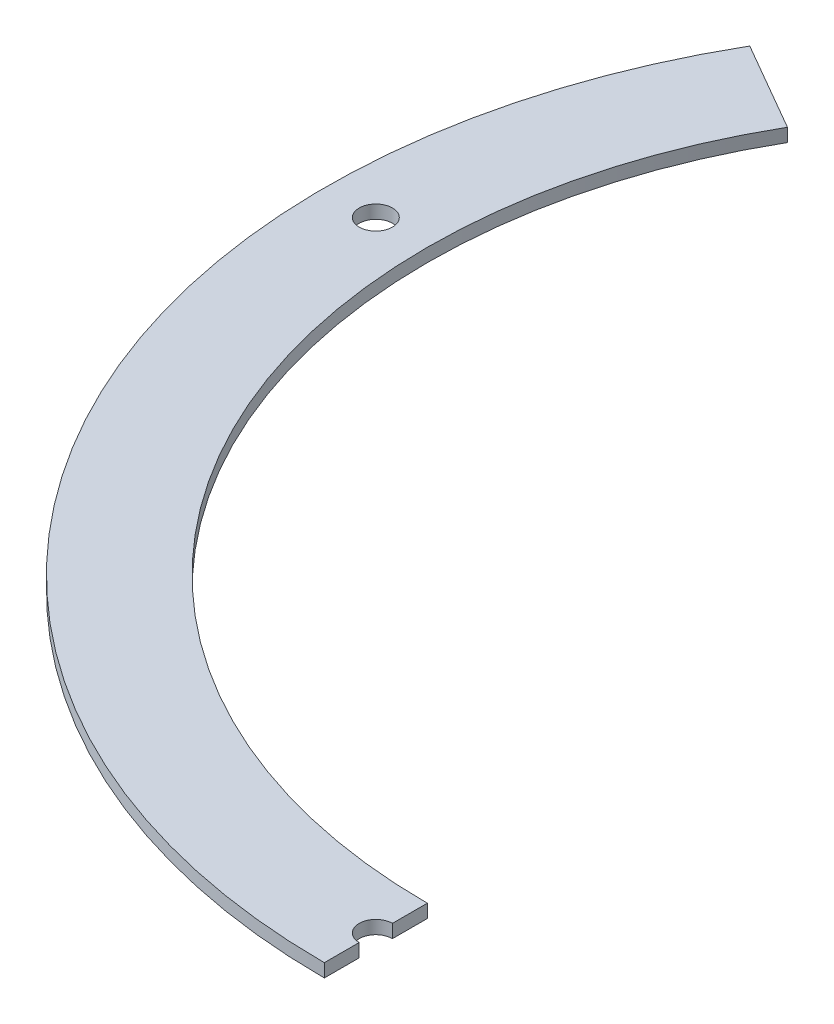
ISO-10303-21;
HEADER;
FILE_DESCRIPTION(('STEP AP214'),'2;1');
FILE_NAME('part.step','',(''),(''),'','','');
FILE_SCHEMA(('AUTOMOTIVE_DESIGN { 1 0 10303 214 1 1 1 1 }'));
ENDSEC;
DATA;
#1=APPLICATION_CONTEXT('core data for automotive mechanical design processes');
#2=APPLICATION_PROTOCOL_DEFINITION('international standard','automotive_design',2000,#1);
#3=PRODUCT_CONTEXT('',#1,'mechanical');
#4=PRODUCT('Part','Part','',(#3));
#5=PRODUCT_RELATED_PRODUCT_CATEGORY('part','',(#4));
#6=PRODUCT_DEFINITION_FORMATION('','',#4);
#7=PRODUCT_DEFINITION_CONTEXT('part definition',#1,'design');
#8=PRODUCT_DEFINITION('design','',#6,#7);
#9=PRODUCT_DEFINITION_SHAPE('','',#8);
#10=(LENGTH_UNIT() NAMED_UNIT(*) SI_UNIT(.MILLI.,.METRE.));
#11=(NAMED_UNIT(*) PLANE_ANGLE_UNIT() SI_UNIT($,.RADIAN.));
#12=(NAMED_UNIT(*) SI_UNIT($,.STERADIAN.) SOLID_ANGLE_UNIT());
#13=UNCERTAINTY_MEASURE_WITH_UNIT(LENGTH_MEASURE(1.E-05),#10,'distance_accuracy_value','');
#14=(GEOMETRIC_REPRESENTATION_CONTEXT(3) GLOBAL_UNCERTAINTY_ASSIGNED_CONTEXT((#13)) GLOBAL_UNIT_ASSIGNED_CONTEXT((#10,
#11,#12)) REPRESENTATION_CONTEXT('',''));
#15=CARTESIAN_POINT('',(0.,0.,0.));
#16=DIRECTION('',(0.,0.,1.));
#17=DIRECTION('',(1.,0.,0.));
#18=AXIS2_PLACEMENT_3D('',#15,#16,#17);
#19=CARTESIAN_POINT('',(0.,2.,0.));
#20=DIRECTION('',(0.,-1.,0.));
#21=DIRECTION('',(0.,0.,-1.));
#22=AXIS2_PLACEMENT_3D('',#19,#20,#21);
#23=CYLINDRICAL_SURFACE('',#22,101.);
#24=DIRECTION('',(0.,-1.,0.));
#25=VECTOR('',#24,1.);
#26=CARTESIAN_POINT('',(0.,2.,101.));
#27=LINE('',#26,#25);
#28=CARTESIAN_POINT('',(0.,2.,101.));
#29=VERTEX_POINT('',#28);
#30=CARTESIAN_POINT('',(0.,0.,101.));
#31=VERTEX_POINT('',#30);
#32=EDGE_CURVE('E106',#29,#31,#27,.T.);
#33=ORIENTED_EDGE('',*,*,#32,.F.);
#34=CARTESIAN_POINT('',(0.,2.,0.));
#35=DIRECTION('',(0.,1.,0.));
#36=DIRECTION('',(0.,0.,1.));
#37=AXIS2_PLACEMENT_3D('',#34,#35,#36);
#38=CIRCLE('',#37,101.);
#39=CARTESIAN_POINT('',(-87.4685657822286,2.,-50.4999999999995));
#40=VERTEX_POINT('',#39);
#41=EDGE_CURVE('E136',#40,#29,#38,.T.);
#42=ORIENTED_EDGE('',*,*,#41,.F.);
#43=DIRECTION('',(0.,-1.,0.));
#44=VECTOR('',#43,1.);
#45=CARTESIAN_POINT('',(-87.4685657822286,2.,-50.4999999999995));
#46=LINE('',#45,#44);
#47=CARTESIAN_POINT('',(-87.4685657822286,0.,-50.4999999999995));
#48=VERTEX_POINT('',#47);
#49=EDGE_CURVE('E124',#40,#48,#46,.T.);
#50=ORIENTED_EDGE('',*,*,#49,.T.);
#51=CARTESIAN_POINT('',(0.,0.,0.));
#52=DIRECTION('',(0.,1.,0.));
#53=DIRECTION('',(0.,0.,1.));
#54=AXIS2_PLACEMENT_3D('',#51,#52,#53);
#55=CIRCLE('',#54,101.);
#56=EDGE_CURVE('E130',#48,#31,#55,.T.);
#57=ORIENTED_EDGE('',*,*,#56,.T.);
#58=EDGE_LOOP('',(#33,#42,#50,#57));
#59=FACE_BOUND('',#58,.T.);
#60=ADVANCED_FACE('F45',(#59),#23,.T.);
#61=CARTESIAN_POINT('',(0.,2.,0.));
#62=DIRECTION('',(0.,-1.,0.));
#63=DIRECTION('',(0.,0.,-1.));
#64=AXIS2_PLACEMENT_3D('',#61,#62,#63);
#65=CYLINDRICAL_SURFACE('',#64,85.5);
#66=CARTESIAN_POINT('',(0.,2.,0.));
#67=DIRECTION('',(0.,1.,0.));
#68=DIRECTION('',(0.,0.,1.));
#69=AXIS2_PLACEMENT_3D('',#66,#67,#68);
#70=CIRCLE('',#69,85.5);
#71=CARTESIAN_POINT('',(-74.0451720235698,2.,-42.7499999999996));
#72=VERTEX_POINT('',#71);
#73=CARTESIAN_POINT('',(0.,2.,85.5));
#74=VERTEX_POINT('',#73);
#75=EDGE_CURVE('E11',#72,#74,#70,.T.);
#76=ORIENTED_EDGE('',*,*,#75,.T.);
#77=DIRECTION('',(0.,-1.,0.));
#78=VECTOR('',#77,1.);
#79=CARTESIAN_POINT('',(0.,2.,85.5));
#80=LINE('',#79,#78);
#81=CARTESIAN_POINT('',(0.,0.,85.5));
#82=VERTEX_POINT('',#81);
#83=EDGE_CURVE('E98',#74,#82,#80,.T.);
#84=ORIENTED_EDGE('',*,*,#83,.T.);
#85=CARTESIAN_POINT('',(0.,0.,0.));
#86=DIRECTION('',(0.,1.,0.));
#87=DIRECTION('',(0.,0.,1.));
#88=AXIS2_PLACEMENT_3D('',#85,#86,#87);
#89=CIRCLE('',#88,85.5);
#90=CARTESIAN_POINT('',(-74.0451720235698,0.,-42.7499999999996));
#91=VERTEX_POINT('',#90);
#92=EDGE_CURVE('E48',#91,#82,#89,.T.);
#93=ORIENTED_EDGE('',*,*,#92,.F.);
#94=DIRECTION('',(0.,-1.,0.));
#95=VECTOR('',#94,1.);
#96=CARTESIAN_POINT('',(-74.0451720235698,2.,-42.7499999999996));
#97=LINE('',#96,#95);
#98=EDGE_CURVE('E120',#72,#91,#97,.T.);
#99=ORIENTED_EDGE('',*,*,#98,.F.);
#100=EDGE_LOOP('',(#76,#84,#93,#99));
#101=FACE_BOUND('',#100,.T.);
#102=ADVANCED_FACE('F119',(#101),#65,.F.);
#103=CARTESIAN_POINT('',(0.,2.,0.));
#104=DIRECTION('',(0.,1.,0.));
#105=DIRECTION('',(0.,0.,1.));
#106=AXIS2_PLACEMENT_3D('',#103,#104,#105);
#107=PLANE('',#106);
#108=CARTESIAN_POINT('',(-93.25,2.,-9.76741904541367E-13));
#109=DIRECTION('',(0.,1.,0.));
#110=DIRECTION('',(0.,0.,1.));
#111=AXIS2_PLACEMENT_3D('',#108,#109,#110);
#112=CIRCLE('',#111,2.5);
#113=CARTESIAN_POINT('',(-93.25,2.,2.49999999999902));
#114=VERTEX_POINT('',#113);
#115=EDGE_CURVE('E140',#114,#114,#112,.T.);
#116=ORIENTED_EDGE('',*,*,#115,.F.);
#117=EDGE_LOOP('',(#116));
#118=FACE_BOUND('',#117,.T.);
#119=CARTESIAN_POINT('',(-6.51161269694244E-13,2.,93.25));
#120=DIRECTION('',(0.,1.,0.));
#121=DIRECTION('',(0.,0.,1.));
#122=AXIS2_PLACEMENT_3D('',#119,#120,#121);
#123=CIRCLE('',#122,2.5);
#124=CARTESIAN_POINT('',(-6.51161269694244E-13,2.,90.75));
#125=VERTEX_POINT('',#124);
#126=CARTESIAN_POINT('',(0.,2.,95.75));
#127=VERTEX_POINT('',#126);
#128=EDGE_CURVE('E54',#125,#127,#123,.T.);
#129=ORIENTED_EDGE('',*,*,#128,.F.);
#130=DIRECTION('',(0.,0.,1.));
#131=VECTOR('',#130,1.);
#132=CARTESIAN_POINT('',(0.,2.,0.));
#133=LINE('',#132,#131);
#134=EDGE_CURVE('E70',#74,#125,#133,.T.);
#135=ORIENTED_EDGE('',*,*,#134,.F.);
#136=ORIENTED_EDGE('',*,*,#75,.F.);
#137=DIRECTION('',(-0.866025403784442,0.,-0.499999999999995));
#138=VECTOR('',#137,1.);
#139=CARTESIAN_POINT('',(0.,2.,0.));
#140=LINE('',#139,#138);
#141=EDGE_CURVE('E125',#72,#40,#140,.T.);
#142=ORIENTED_EDGE('',*,*,#141,.T.);
#143=ORIENTED_EDGE('',*,*,#41,.T.);
#144=EDGE_CURVE('E107',#127,#29,#133,.T.);
#145=ORIENTED_EDGE('',*,*,#144,.F.);
#146=EDGE_LOOP('',(#129,#135,#136,#142,#143,#145));
#147=FACE_BOUND('',#146,.T.);
#148=ADVANCED_FACE('F112',(#118,#147),#107,.T.);
#149=CARTESIAN_POINT('',(0.,0.,0.));
#150=DIRECTION('',(0.,1.,0.));
#151=DIRECTION('',(0.,0.,1.));
#152=AXIS2_PLACEMENT_3D('',#149,#150,#151);
#153=PLANE('',#152);
#154=CARTESIAN_POINT('',(-93.25,0.,-9.76741904541367E-13));
#155=DIRECTION('',(0.,1.,0.));
#156=DIRECTION('',(0.,0.,1.));
#157=AXIS2_PLACEMENT_3D('',#154,#155,#156);
#158=CIRCLE('',#157,2.5);
#159=CARTESIAN_POINT('',(-93.25,0.,2.49999999999902));
#160=VERTEX_POINT('',#159);
#161=EDGE_CURVE('E149',#160,#160,#158,.T.);
#162=ORIENTED_EDGE('',*,*,#161,.T.);
#163=EDGE_LOOP('',(#162));
#164=FACE_BOUND('',#163,.T.);
#165=DIRECTION('',(0.,0.,1.));
#166=VECTOR('',#165,1.);
#167=CARTESIAN_POINT('',(0.,0.,0.));
#168=LINE('',#167,#166);
#169=CARTESIAN_POINT('',(0.,0.,90.75));
#170=VERTEX_POINT('',#169);
#171=EDGE_CURVE('E101',#82,#170,#168,.T.);
#172=ORIENTED_EDGE('',*,*,#171,.T.);
#173=CARTESIAN_POINT('',(-6.51161269694244E-13,0.,93.25));
#174=DIRECTION('',(0.,1.,0.));
#175=DIRECTION('',(0.,0.,1.));
#176=AXIS2_PLACEMENT_3D('',#173,#174,#175);
#177=CIRCLE('',#176,2.5);
#178=CARTESIAN_POINT('',(0.,0.,95.75));
#179=VERTEX_POINT('',#178);
#180=EDGE_CURVE('E152',#170,#179,#177,.T.);
#181=ORIENTED_EDGE('',*,*,#180,.T.);
#182=EDGE_CURVE('E62',#179,#31,#168,.T.);
#183=ORIENTED_EDGE('',*,*,#182,.T.);
#184=ORIENTED_EDGE('',*,*,#56,.F.);
#185=DIRECTION('',(-0.866025403784442,0.,-0.499999999999995));
#186=VECTOR('',#185,1.);
#187=CARTESIAN_POINT('',(0.,0.,0.));
#188=LINE('',#187,#186);
#189=EDGE_CURVE('E132',#91,#48,#188,.T.);
#190=ORIENTED_EDGE('',*,*,#189,.F.);
#191=ORIENTED_EDGE('',*,*,#92,.T.);
#192=EDGE_LOOP('',(#172,#181,#183,#184,#190,#191));
#193=FACE_BOUND('',#192,.T.);
#194=ADVANCED_FACE('F158',(#164,#193),#153,.F.);
#195=CARTESIAN_POINT('',(-6.51161269694244E-13,2.,93.25));
#196=DIRECTION('',(0.,-1.,0.));
#197=DIRECTION('',(0.,0.,-1.));
#198=AXIS2_PLACEMENT_3D('',#195,#196,#197);
#199=CYLINDRICAL_SURFACE('',#198,2.5);
#200=ORIENTED_EDGE('',*,*,#180,.F.);
#201=DIRECTION('',(0.,-1.,0.));
#202=VECTOR('',#201,1.);
#203=CARTESIAN_POINT('',(0.,2.,90.75));
#204=LINE('',#203,#202);
#205=EDGE_CURVE('E161',#125,#170,#204,.T.);
#206=ORIENTED_EDGE('',*,*,#205,.F.);
#207=ORIENTED_EDGE('',*,*,#128,.T.);
#208=DIRECTION('',(0.,-1.,0.));
#209=VECTOR('',#208,1.);
#210=CARTESIAN_POINT('',(0.,2.,95.75));
#211=LINE('',#210,#209);
#212=EDGE_CURVE('E163',#127,#179,#211,.T.);
#213=ORIENTED_EDGE('',*,*,#212,.T.);
#214=EDGE_LOOP('',(#200,#206,#207,#213));
#215=FACE_BOUND('',#214,.T.);
#216=ADVANCED_FACE('F178',(#215),#199,.F.);
#217=CARTESIAN_POINT('',(-93.25,2.,-9.76741904541367E-13));
#218=DIRECTION('',(0.,-1.,0.));
#219=DIRECTION('',(0.,0.,-1.));
#220=AXIS2_PLACEMENT_3D('',#217,#218,#219);
#221=CYLINDRICAL_SURFACE('',#220,2.5);
#222=ORIENTED_EDGE('',*,*,#115,.T.);
#223=EDGE_LOOP('',(#222));
#224=FACE_BOUND('',#223,.T.);
#225=ORIENTED_EDGE('',*,*,#161,.F.);
#226=EDGE_LOOP('',(#225));
#227=FACE_BOUND('',#226,.T.);
#228=ADVANCED_FACE('F187',(#224,#227),#221,.F.);
#229=CARTESIAN_POINT('',(0.,2.,0.));
#230=DIRECTION('',(-0.499999999999995,0.,0.866025403784442));
#231=DIRECTION('',(0.866025403784442,0.,0.499999999999995));
#232=AXIS2_PLACEMENT_3D('',#229,#230,#231);
#233=PLANE('',#232);
#234=ORIENTED_EDGE('',*,*,#189,.T.);
#235=ORIENTED_EDGE('',*,*,#49,.F.);
#236=ORIENTED_EDGE('',*,*,#141,.F.);
#237=ORIENTED_EDGE('',*,*,#98,.T.);
#238=EDGE_LOOP('',(#234,#235,#236,#237));
#239=FACE_BOUND('',#238,.T.);
#240=ADVANCED_FACE('F175',(#239),#233,.F.);
#241=CARTESIAN_POINT('',(0.,2.,0.));
#242=DIRECTION('',(1.,0.,0.));
#243=DIRECTION('',(0.,0.,-1.));
#244=AXIS2_PLACEMENT_3D('',#241,#242,#243);
#245=PLANE('',#244);
#246=ORIENTED_EDGE('',*,*,#182,.F.);
#247=ORIENTED_EDGE('',*,*,#212,.F.);
#248=ORIENTED_EDGE('',*,*,#144,.T.);
#249=ORIENTED_EDGE('',*,*,#32,.T.);
#250=EDGE_LOOP('',(#246,#247,#248,#249));
#251=FACE_BOUND('',#250,.T.);
#252=ADVANCED_FACE('F179',(#251),#245,.T.);
#253=ORIENTED_EDGE('',*,*,#171,.F.);
#254=ORIENTED_EDGE('',*,*,#83,.F.);
#255=ORIENTED_EDGE('',*,*,#134,.T.);
#256=ORIENTED_EDGE('',*,*,#205,.T.);
#257=EDGE_LOOP('',(#253,#254,#255,#256));
#258=FACE_BOUND('',#257,.T.);
#259=ADVANCED_FACE('F99',(#258),#245,.T.);
#260=CLOSED_SHELL('',(#60,#102,#148,#194,#216,#228,#240,#252,#259));
#261=MANIFOLD_SOLID_BREP('B2',#260);
#262=ADVANCED_BREP_SHAPE_REPRESENTATION('',(#18,#261),#14);
#263=SHAPE_DEFINITION_REPRESENTATION(#9,#262);
ENDSEC;
END-ISO-10303-21;
